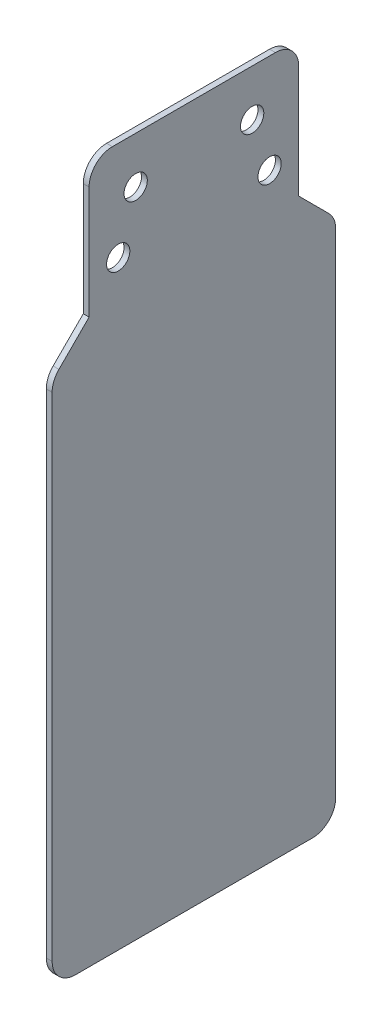
ISO-10303-21;
HEADER;
FILE_DESCRIPTION(('STEP AP214'),'2;1');
FILE_NAME('part.step','',(''),(''),'','','');
FILE_SCHEMA(('AUTOMOTIVE_DESIGN { 1 0 10303 214 1 1 1 1 }'));
ENDSEC;
DATA;
#1=APPLICATION_CONTEXT('core data for automotive mechanical design processes');
#2=APPLICATION_PROTOCOL_DEFINITION('international standard','automotive_design',2000,#1);
#3=PRODUCT_CONTEXT('',#1,'mechanical');
#4=PRODUCT('Part','Part','',(#3));
#5=PRODUCT_RELATED_PRODUCT_CATEGORY('part','',(#4));
#6=PRODUCT_DEFINITION_FORMATION('','',#4);
#7=PRODUCT_DEFINITION_CONTEXT('part definition',#1,'design');
#8=PRODUCT_DEFINITION('design','',#6,#7);
#9=PRODUCT_DEFINITION_SHAPE('','',#8);
#10=(LENGTH_UNIT() NAMED_UNIT(*) SI_UNIT(.MILLI.,.METRE.));
#11=(NAMED_UNIT(*) PLANE_ANGLE_UNIT() SI_UNIT($,.RADIAN.));
#12=(NAMED_UNIT(*) SI_UNIT($,.STERADIAN.) SOLID_ANGLE_UNIT());
#13=UNCERTAINTY_MEASURE_WITH_UNIT(LENGTH_MEASURE(1.E-05),#10,'distance_accuracy_value','');
#14=(GEOMETRIC_REPRESENTATION_CONTEXT(3) GLOBAL_UNCERTAINTY_ASSIGNED_CONTEXT((#13)) GLOBAL_UNIT_ASSIGNED_CONTEXT((#10,
#11,#12)) REPRESENTATION_CONTEXT('',''));
#15=CARTESIAN_POINT('',(0.,0.,0.));
#16=DIRECTION('',(0.,0.,1.));
#17=DIRECTION('',(1.,0.,0.));
#18=AXIS2_PLACEMENT_3D('',#15,#16,#17);
#19=CARTESIAN_POINT('',(1.,0.,-18.));
#20=DIRECTION('',(0.,0.,-1.));
#21=DIRECTION('',(0.,1.,0.));
#22=AXIS2_PLACEMENT_3D('',#19,#20,#21);
#23=PLANE('',#22);
#24=DIRECTION('',(0.,-1.,0.));
#25=VECTOR('',#24,1.);
#26=CARTESIAN_POINT('',(0.,0.,-18.));
#27=LINE('',#26,#25);
#28=CARTESIAN_POINT('',(0.,-3.99999999999999,-18.));
#29=VERTEX_POINT('',#28);
#30=CARTESIAN_POINT('',(0.,-23.35,-18.));
#31=VERTEX_POINT('',#30);
#32=EDGE_CURVE('E163',#29,#31,#27,.T.);
#33=ORIENTED_EDGE('',*,*,#32,.F.);
#34=DIRECTION('',(-1.,0.,0.));
#35=VECTOR('',#34,1.);
#36=CARTESIAN_POINT('',(1.,-3.99999999999999,-18.));
#37=LINE('',#36,#35);
#38=CARTESIAN_POINT('',(1.,-3.99999999999999,-18.));
#39=VERTEX_POINT('',#38);
#40=EDGE_CURVE('E11',#29,#39,#37,.F.);
#41=ORIENTED_EDGE('',*,*,#40,.T.);
#42=DIRECTION('',(0.,-1.,0.));
#43=VECTOR('',#42,1.);
#44=CARTESIAN_POINT('',(1.,0.,-18.));
#45=LINE('',#44,#43);
#46=CARTESIAN_POINT('',(1.,-23.35,-18.));
#47=VERTEX_POINT('',#46);
#48=EDGE_CURVE('E242',#39,#47,#45,.T.);
#49=ORIENTED_EDGE('',*,*,#48,.T.);
#50=DIRECTION('',(-1.,0.,0.));
#51=VECTOR('',#50,1.);
#52=CARTESIAN_POINT('',(97.858375992993,-23.35,-18.));
#53=LINE('',#52,#51);
#54=EDGE_CURVE('E150',#47,#31,#53,.T.);
#55=ORIENTED_EDGE('',*,*,#54,.T.);
#56=EDGE_LOOP('',(#33,#41,#49,#55));
#57=FACE_BOUND('',#56,.T.);
#58=ADVANCED_FACE('F36',(#57),#23,.T.);
#59=CARTESIAN_POINT('',(1.,0.,18.));
#60=DIRECTION('',(0.,0.,-1.));
#61=DIRECTION('',(0.,1.,0.));
#62=AXIS2_PLACEMENT_3D('',#59,#60,#61);
#63=PLANE('',#62);
#64=DIRECTION('',(0.,-1.,0.));
#65=VECTOR('',#64,1.);
#66=CARTESIAN_POINT('',(1.,0.,18.));
#67=LINE('',#66,#65);
#68=CARTESIAN_POINT('',(1.,-4.,18.));
#69=VERTEX_POINT('',#68);
#70=CARTESIAN_POINT('',(1.,-23.35,18.));
#71=VERTEX_POINT('',#70);
#72=EDGE_CURVE('E247',#69,#71,#67,.T.);
#73=ORIENTED_EDGE('',*,*,#72,.F.);
#74=DIRECTION('',(-1.,0.,0.));
#75=VECTOR('',#74,1.);
#76=CARTESIAN_POINT('',(0.,-4.,18.));
#77=LINE('',#76,#75);
#78=CARTESIAN_POINT('',(0.,-4.,18.));
#79=VERTEX_POINT('',#78);
#80=EDGE_CURVE('E249',#69,#79,#77,.T.);
#81=ORIENTED_EDGE('',*,*,#80,.T.);
#82=DIRECTION('',(0.,-1.,0.));
#83=VECTOR('',#82,1.);
#84=CARTESIAN_POINT('',(0.,0.,18.));
#85=LINE('',#84,#83);
#86=CARTESIAN_POINT('',(0.,-23.35,18.));
#87=VERTEX_POINT('',#86);
#88=EDGE_CURVE('E243',#79,#87,#85,.T.);
#89=ORIENTED_EDGE('',*,*,#88,.T.);
#90=DIRECTION('',(-1.,0.,0.));
#91=VECTOR('',#90,1.);
#92=CARTESIAN_POINT('',(97.858375992993,-23.35,18.));
#93=LINE('',#92,#91);
#94=EDGE_CURVE('E187',#71,#87,#93,.T.);
#95=ORIENTED_EDGE('',*,*,#94,.F.);
#96=EDGE_LOOP('',(#73,#81,#89,#95));
#97=FACE_BOUND('',#96,.T.);
#98=ADVANCED_FACE('F275',(#97),#63,.F.);
#99=CARTESIAN_POINT('',(1.,0.,18.));
#100=DIRECTION('',(0.,1.,0.));
#101=DIRECTION('',(0.,0.,1.));
#102=AXIS2_PLACEMENT_3D('',#99,#100,#101);
#103=PLANE('',#102);
#104=DIRECTION('',(0.,0.,-1.));
#105=VECTOR('',#104,1.);
#106=CARTESIAN_POINT('',(0.,0.,18.));
#107=LINE('',#106,#105);
#108=CARTESIAN_POINT('',(0.,0.,14.));
#109=VERTEX_POINT('',#108);
#110=CARTESIAN_POINT('',(0.,0.,-14.));
#111=VERTEX_POINT('',#110);
#112=EDGE_CURVE('E239',#109,#111,#107,.T.);
#113=ORIENTED_EDGE('',*,*,#112,.F.);
#114=DIRECTION('',(-1.,0.,0.));
#115=VECTOR('',#114,1.);
#116=CARTESIAN_POINT('',(1.,0.,14.));
#117=LINE('',#116,#115);
#118=CARTESIAN_POINT('',(1.,0.,14.));
#119=VERTEX_POINT('',#118);
#120=EDGE_CURVE('E265',#109,#119,#117,.F.);
#121=ORIENTED_EDGE('',*,*,#120,.T.);
#122=DIRECTION('',(0.,0.,-1.));
#123=VECTOR('',#122,1.);
#124=CARTESIAN_POINT('',(1.,0.,18.));
#125=LINE('',#124,#123);
#126=CARTESIAN_POINT('',(1.,0.,-14.));
#127=VERTEX_POINT('',#126);
#128=EDGE_CURVE('E240',#119,#127,#125,.T.);
#129=ORIENTED_EDGE('',*,*,#128,.T.);
#130=DIRECTION('',(-1.,0.,0.));
#131=VECTOR('',#130,1.);
#132=CARTESIAN_POINT('',(1.,0.,-14.));
#133=LINE('',#132,#131);
#134=EDGE_CURVE('E262',#127,#111,#133,.T.);
#135=ORIENTED_EDGE('',*,*,#134,.T.);
#136=EDGE_LOOP('',(#113,#121,#129,#135));
#137=FACE_BOUND('',#136,.T.);
#138=ADVANCED_FACE('F280',(#137),#103,.T.);
#139=CARTESIAN_POINT('',(1.,-120.,18.));
#140=DIRECTION('',(0.,1.,0.));
#141=DIRECTION('',(0.,0.,1.));
#142=AXIS2_PLACEMENT_3D('',#139,#140,#141);
#143=PLANE('',#142);
#144=DIRECTION('',(0.,0.,-1.));
#145=VECTOR('',#144,1.);
#146=CARTESIAN_POINT('',(0.,-120.,18.));
#147=LINE('',#146,#145);
#148=CARTESIAN_POINT('',(0.,-120.,20.35));
#149=VERTEX_POINT('',#148);
#150=CARTESIAN_POINT('',(0.,-120.,-20.35));
#151=VERTEX_POINT('',#150);
#152=EDGE_CURVE('E253',#149,#151,#147,.T.);
#153=ORIENTED_EDGE('',*,*,#152,.T.);
#154=DIRECTION('',(-1.,0.,0.));
#155=VECTOR('',#154,1.);
#156=CARTESIAN_POINT('',(97.858375992993,-120.,-20.35));
#157=LINE('',#156,#155);
#158=CARTESIAN_POINT('',(1.,-120.,-20.35));
#159=VERTEX_POINT('',#158);
#160=EDGE_CURVE('E173',#159,#151,#157,.T.);
#161=ORIENTED_EDGE('',*,*,#160,.F.);
#162=DIRECTION('',(0.,0.,-1.));
#163=VECTOR('',#162,1.);
#164=CARTESIAN_POINT('',(1.,-120.,18.));
#165=LINE('',#164,#163);
#166=CARTESIAN_POINT('',(1.,-120.,20.35));
#167=VERTEX_POINT('',#166);
#168=EDGE_CURVE('E245',#167,#159,#165,.T.);
#169=ORIENTED_EDGE('',*,*,#168,.F.);
#170=DIRECTION('',(-1.,0.,0.));
#171=VECTOR('',#170,1.);
#172=CARTESIAN_POINT('',(97.858375992993,-120.,20.35));
#173=LINE('',#172,#171);
#174=EDGE_CURVE('E205',#167,#149,#173,.T.);
#175=ORIENTED_EDGE('',*,*,#174,.T.);
#176=EDGE_LOOP('',(#153,#161,#169,#175));
#177=FACE_BOUND('',#176,.T.);
#178=ADVANCED_FACE('F297',(#177),#143,.F.);
#179=CARTESIAN_POINT('',(1.,0.,0.));
#180=DIRECTION('',(-1.,0.,0.));
#181=DIRECTION('',(0.,0.,1.));
#182=AXIS2_PLACEMENT_3D('',#179,#180,#181);
#183=PLANE('',#182);
#184=CARTESIAN_POINT('',(1.,-17.,-13.));
#185=DIRECTION('',(-1.,0.,0.));
#186=DIRECTION('',(0.,0.,1.));
#187=AXIS2_PLACEMENT_3D('',#184,#185,#186);
#188=CIRCLE('',#187,2.);
#189=CARTESIAN_POINT('',(1.,-17.,-11.));
#190=VERTEX_POINT('',#189);
#191=EDGE_CURVE('E218',#190,#190,#188,.T.);
#192=ORIENTED_EDGE('',*,*,#191,.T.);
#193=EDGE_LOOP('',(#192));
#194=FACE_BOUND('',#193,.T.);
#195=CARTESIAN_POINT('',(1.,-17.,13.));
#196=DIRECTION('',(-1.,0.,0.));
#197=DIRECTION('',(0.,0.,1.));
#198=AXIS2_PLACEMENT_3D('',#195,#196,#197);
#199=CIRCLE('',#198,2.);
#200=CARTESIAN_POINT('',(1.,-17.,15.));
#201=VERTEX_POINT('',#200);
#202=EDGE_CURVE('E224',#201,#201,#199,.T.);
#203=ORIENTED_EDGE('',*,*,#202,.T.);
#204=EDGE_LOOP('',(#203));
#205=FACE_BOUND('',#204,.T.);
#206=CARTESIAN_POINT('',(1.,-8.,-9.99999999999999));
#207=DIRECTION('',(-1.,0.,0.));
#208=DIRECTION('',(0.,0.,1.));
#209=AXIS2_PLACEMENT_3D('',#206,#207,#208);
#210=CIRCLE('',#209,2.);
#211=CARTESIAN_POINT('',(1.,-8.,-7.99999999999999));
#212=VERTEX_POINT('',#211);
#213=EDGE_CURVE('E230',#212,#212,#210,.T.);
#214=ORIENTED_EDGE('',*,*,#213,.T.);
#215=EDGE_LOOP('',(#214));
#216=FACE_BOUND('',#215,.T.);
#217=CARTESIAN_POINT('',(1.,-8.,10.));
#218=DIRECTION('',(-1.,0.,0.));
#219=DIRECTION('',(0.,0.,1.));
#220=AXIS2_PLACEMENT_3D('',#217,#218,#219);
#221=CIRCLE('',#220,2.);
#222=CARTESIAN_POINT('',(1.,-8.,12.));
#223=VERTEX_POINT('',#222);
#224=EDGE_CURVE('E236',#223,#223,#221,.T.);
#225=ORIENTED_EDGE('',*,*,#224,.T.);
#226=EDGE_LOOP('',(#225));
#227=FACE_BOUND('',#226,.T.);
#228=ORIENTED_EDGE('',*,*,#128,.F.);
#229=CARTESIAN_POINT('',(1.,-4.,14.));
#230=DIRECTION('',(-1.,0.,0.));
#231=DIRECTION('',(0.,0.,1.));
#232=AXIS2_PLACEMENT_3D('',#229,#230,#231);
#233=CIRCLE('',#232,4.);
#234=EDGE_CURVE('E44',#119,#69,#233,.F.);
#235=ORIENTED_EDGE('',*,*,#234,.T.);
#236=ORIENTED_EDGE('',*,*,#72,.T.);
#237=DIRECTION('',(0.,-0.707106781186551,0.707106781186544));
#238=VECTOR('',#237,1.);
#239=CARTESIAN_POINT('',(1.,-23.35,18.));
#240=LINE('',#239,#238);
#241=CARTESIAN_POINT('',(1.,-28.5284271247463,23.1784271247462));
#242=VERTEX_POINT('',#241);
#243=EDGE_CURVE('E191',#71,#242,#240,.T.);
#244=ORIENTED_EDGE('',*,*,#243,.T.);
#245=CARTESIAN_POINT('',(1.,-31.3568542494924,20.35));
#246=DIRECTION('',(-1.,0.,0.));
#247=DIRECTION('',(0.,0.,1.));
#248=AXIS2_PLACEMENT_3D('',#245,#246,#247);
#249=CIRCLE('',#248,4.);
#250=CARTESIAN_POINT('',(1.,-31.3568542494924,24.35));
#251=VERTEX_POINT('',#250);
#252=EDGE_CURVE('E189',#242,#251,#249,.F.);
#253=ORIENTED_EDGE('',*,*,#252,.T.);
#254=DIRECTION('',(0.,-1.,0.));
#255=VECTOR('',#254,1.);
#256=CARTESIAN_POINT('',(1.,-31.3568542494924,24.35));
#257=LINE('',#256,#255);
#258=CARTESIAN_POINT('',(1.,-116.,24.35));
#259=VERTEX_POINT('',#258);
#260=EDGE_CURVE('E186',#251,#259,#257,.T.);
#261=ORIENTED_EDGE('',*,*,#260,.T.);
#262=CARTESIAN_POINT('',(1.,-116.,20.35));
#263=DIRECTION('',(-1.,0.,0.));
#264=DIRECTION('',(0.,0.,1.));
#265=AXIS2_PLACEMENT_3D('',#262,#263,#264);
#266=CIRCLE('',#265,4.);
#267=EDGE_CURVE('E183',#259,#167,#266,.F.);
#268=ORIENTED_EDGE('',*,*,#267,.T.);
#269=ORIENTED_EDGE('',*,*,#168,.T.);
#270=CARTESIAN_POINT('',(1.,-116.,-20.35));
#271=DIRECTION('',(-1.,0.,0.));
#272=DIRECTION('',(0.,0.,1.));
#273=AXIS2_PLACEMENT_3D('',#270,#271,#272);
#274=CIRCLE('',#273,4.);
#275=CARTESIAN_POINT('',(1.,-116.,-24.35));
#276=VERTEX_POINT('',#275);
#277=EDGE_CURVE('E166',#159,#276,#274,.F.);
#278=ORIENTED_EDGE('',*,*,#277,.T.);
#279=DIRECTION('',(0.,1.,0.));
#280=VECTOR('',#279,1.);
#281=CARTESIAN_POINT('',(1.,-31.3568542494924,-24.35));
#282=LINE('',#281,#280);
#283=CARTESIAN_POINT('',(1.,-31.3568542494924,-24.35));
#284=VERTEX_POINT('',#283);
#285=EDGE_CURVE('E284',#276,#284,#282,.T.);
#286=ORIENTED_EDGE('',*,*,#285,.T.);
#287=CARTESIAN_POINT('',(1.,-31.3568542494924,-20.35));
#288=DIRECTION('',(-1.,0.,0.));
#289=DIRECTION('',(0.,0.,1.));
#290=AXIS2_PLACEMENT_3D('',#287,#288,#289);
#291=CIRCLE('',#290,4.);
#292=CARTESIAN_POINT('',(1.,-28.5284271247463,-23.1784271247462));
#293=VERTEX_POINT('',#292);
#294=EDGE_CURVE('E176',#284,#293,#291,.F.);
#295=ORIENTED_EDGE('',*,*,#294,.T.);
#296=DIRECTION('',(0.,0.707106781186552,0.707106781186543));
#297=VECTOR('',#296,1.);
#298=CARTESIAN_POINT('',(1.,-23.35,-18.));
#299=LINE('',#298,#297);
#300=EDGE_CURVE('E146',#293,#47,#299,.T.);
#301=ORIENTED_EDGE('',*,*,#300,.T.);
#302=ORIENTED_EDGE('',*,*,#48,.F.);
#303=CARTESIAN_POINT('',(1.,-3.99999999999999,-14.));
#304=DIRECTION('',(-1.,0.,0.));
#305=DIRECTION('',(0.,0.,1.));
#306=AXIS2_PLACEMENT_3D('',#303,#304,#305);
#307=CIRCLE('',#306,4.);
#308=EDGE_CURVE('E56',#39,#127,#307,.F.);
#309=ORIENTED_EDGE('',*,*,#308,.T.);
#310=EDGE_LOOP('',(#228,#235,#236,#244,#253,#261,#268,#269,#278,#286,#295,#301,#302,#309));
#311=FACE_BOUND('',#310,.T.);
#312=ADVANCED_FACE('F269',(#194,#205,#216,#227,#311),#183,.F.);
#313=CARTESIAN_POINT('',(0.,0.,0.));
#314=DIRECTION('',(-1.,0.,0.));
#315=DIRECTION('',(0.,0.,1.));
#316=AXIS2_PLACEMENT_3D('',#313,#314,#315);
#317=PLANE('',#316);
#318=CARTESIAN_POINT('',(0.,-17.,-13.));
#319=DIRECTION('',(-1.,0.,0.));
#320=DIRECTION('',(0.,0.,1.));
#321=AXIS2_PLACEMENT_3D('',#318,#319,#320);
#322=CIRCLE('',#321,2.);
#323=CARTESIAN_POINT('',(0.,-17.,-11.));
#324=VERTEX_POINT('',#323);
#325=EDGE_CURVE('E193',#324,#324,#322,.T.);
#326=ORIENTED_EDGE('',*,*,#325,.F.);
#327=EDGE_LOOP('',(#326));
#328=FACE_BOUND('',#327,.T.);
#329=CARTESIAN_POINT('',(0.,-17.,13.));
#330=DIRECTION('',(-1.,0.,0.));
#331=DIRECTION('',(0.,0.,1.));
#332=AXIS2_PLACEMENT_3D('',#329,#330,#331);
#333=CIRCLE('',#332,2.);
#334=CARTESIAN_POINT('',(0.,-17.,15.));
#335=VERTEX_POINT('',#334);
#336=EDGE_CURVE('E221',#335,#335,#333,.T.);
#337=ORIENTED_EDGE('',*,*,#336,.F.);
#338=EDGE_LOOP('',(#337));
#339=FACE_BOUND('',#338,.T.);
#340=CARTESIAN_POINT('',(0.,-8.,-9.99999999999999));
#341=DIRECTION('',(-1.,0.,0.));
#342=DIRECTION('',(0.,0.,1.));
#343=AXIS2_PLACEMENT_3D('',#340,#341,#342);
#344=CIRCLE('',#343,2.);
#345=CARTESIAN_POINT('',(0.,-8.,-7.99999999999999));
#346=VERTEX_POINT('',#345);
#347=EDGE_CURVE('E227',#346,#346,#344,.T.);
#348=ORIENTED_EDGE('',*,*,#347,.F.);
#349=EDGE_LOOP('',(#348));
#350=FACE_BOUND('',#349,.T.);
#351=CARTESIAN_POINT('',(0.,-8.,10.));
#352=DIRECTION('',(-1.,0.,0.));
#353=DIRECTION('',(0.,0.,1.));
#354=AXIS2_PLACEMENT_3D('',#351,#352,#353);
#355=CIRCLE('',#354,2.);
#356=CARTESIAN_POINT('',(0.,-8.,12.));
#357=VERTEX_POINT('',#356);
#358=EDGE_CURVE('E233',#357,#357,#355,.T.);
#359=ORIENTED_EDGE('',*,*,#358,.F.);
#360=EDGE_LOOP('',(#359));
#361=FACE_BOUND('',#360,.T.);
#362=ORIENTED_EDGE('',*,*,#88,.F.);
#363=CARTESIAN_POINT('',(0.,-4.,14.));
#364=DIRECTION('',(-1.,0.,0.));
#365=DIRECTION('',(0.,0.,1.));
#366=AXIS2_PLACEMENT_3D('',#363,#364,#365);
#367=CIRCLE('',#366,4.);
#368=EDGE_CURVE('E260',#79,#109,#367,.T.);
#369=ORIENTED_EDGE('',*,*,#368,.T.);
#370=ORIENTED_EDGE('',*,*,#112,.T.);
#371=CARTESIAN_POINT('',(0.,-3.99999999999999,-14.));
#372=DIRECTION('',(-1.,0.,0.));
#373=DIRECTION('',(0.,0.,1.));
#374=AXIS2_PLACEMENT_3D('',#371,#372,#373);
#375=CIRCLE('',#374,4.);
#376=EDGE_CURVE('E258',#111,#29,#375,.T.);
#377=ORIENTED_EDGE('',*,*,#376,.T.);
#378=ORIENTED_EDGE('',*,*,#32,.T.);
#379=DIRECTION('',(0.,-0.707106781186552,-0.707106781186543));
#380=VECTOR('',#379,1.);
#381=CARTESIAN_POINT('',(0.,-23.35,-18.));
#382=LINE('',#381,#380);
#383=CARTESIAN_POINT('',(0.,-28.5284271247463,-23.1784271247462));
#384=VERTEX_POINT('',#383);
#385=EDGE_CURVE('E143',#31,#384,#382,.T.);
#386=ORIENTED_EDGE('',*,*,#385,.T.);
#387=CARTESIAN_POINT('',(0.,-31.3568542494924,-20.35));
#388=DIRECTION('',(-1.,0.,0.));
#389=DIRECTION('',(0.,0.,1.));
#390=AXIS2_PLACEMENT_3D('',#387,#388,#389);
#391=CIRCLE('',#390,4.);
#392=CARTESIAN_POINT('',(0.,-31.3568542494924,-24.35));
#393=VERTEX_POINT('',#392);
#394=EDGE_CURVE('E153',#384,#393,#391,.T.);
#395=ORIENTED_EDGE('',*,*,#394,.T.);
#396=DIRECTION('',(0.,-1.,0.));
#397=VECTOR('',#396,1.);
#398=CARTESIAN_POINT('',(0.,-31.3568542494924,-24.35));
#399=LINE('',#398,#397);
#400=CARTESIAN_POINT('',(0.,-116.,-24.35));
#401=VERTEX_POINT('',#400);
#402=EDGE_CURVE('E159',#393,#401,#399,.T.);
#403=ORIENTED_EDGE('',*,*,#402,.T.);
#404=CARTESIAN_POINT('',(0.,-116.,-20.35));
#405=DIRECTION('',(-1.,0.,0.));
#406=DIRECTION('',(0.,0.,1.));
#407=AXIS2_PLACEMENT_3D('',#404,#405,#406);
#408=CIRCLE('',#407,4.);
#409=EDGE_CURVE('E170',#401,#151,#408,.T.);
#410=ORIENTED_EDGE('',*,*,#409,.T.);
#411=ORIENTED_EDGE('',*,*,#152,.F.);
#412=CARTESIAN_POINT('',(0.,-116.,20.35));
#413=DIRECTION('',(-1.,0.,0.));
#414=DIRECTION('',(0.,0.,-1.));
#415=AXIS2_PLACEMENT_3D('',#412,#413,#414);
#416=CIRCLE('',#415,4.);
#417=CARTESIAN_POINT('',(0.,-116.,24.35));
#418=VERTEX_POINT('',#417);
#419=EDGE_CURVE('E182',#149,#418,#416,.T.);
#420=ORIENTED_EDGE('',*,*,#419,.T.);
#421=DIRECTION('',(0.,1.,0.));
#422=VECTOR('',#421,1.);
#423=CARTESIAN_POINT('',(0.,-31.3568542494924,24.35));
#424=LINE('',#423,#422);
#425=CARTESIAN_POINT('',(0.,-31.3568542494924,24.35));
#426=VERTEX_POINT('',#425);
#427=EDGE_CURVE('E196',#418,#426,#424,.T.);
#428=ORIENTED_EDGE('',*,*,#427,.T.);
#429=CARTESIAN_POINT('',(0.,-31.3568542494924,20.35));
#430=DIRECTION('',(-1.,0.,0.));
#431=DIRECTION('',(0.,0.,-1.));
#432=AXIS2_PLACEMENT_3D('',#429,#430,#431);
#433=CIRCLE('',#432,4.);
#434=CARTESIAN_POINT('',(0.,-28.5284271247463,23.1784271247462));
#435=VERTEX_POINT('',#434);
#436=EDGE_CURVE('E199',#426,#435,#433,.T.);
#437=ORIENTED_EDGE('',*,*,#436,.T.);
#438=DIRECTION('',(0.,0.707106781186551,-0.707106781186544));
#439=VECTOR('',#438,1.);
#440=CARTESIAN_POINT('',(0.,-23.35,18.));
#441=LINE('',#440,#439);
#442=EDGE_CURVE('E202',#435,#87,#441,.T.);
#443=ORIENTED_EDGE('',*,*,#442,.T.);
#444=EDGE_LOOP('',(#362,#369,#370,#377,#378,#386,#395,#403,#410,#411,#420,#428,#437,#443));
#445=FACE_BOUND('',#444,.T.);
#446=ADVANCED_FACE('F162',(#328,#339,#350,#361,#445),#317,.T.);
#447=CARTESIAN_POINT('',(0.,-8.,10.));
#448=DIRECTION('',(-1.,0.,0.));
#449=DIRECTION('',(0.,0.,1.));
#450=AXIS2_PLACEMENT_3D('',#447,#448,#449);
#451=CYLINDRICAL_SURFACE('',#450,2.);
#452=ORIENTED_EDGE('',*,*,#224,.F.);
#453=EDGE_LOOP('',(#452));
#454=FACE_BOUND('',#453,.T.);
#455=ORIENTED_EDGE('',*,*,#358,.T.);
#456=EDGE_LOOP('',(#455));
#457=FACE_BOUND('',#456,.T.);
#458=ADVANCED_FACE('F364',(#454,#457),#451,.F.);
#459=CARTESIAN_POINT('',(0.,-8.,-9.99999999999999));
#460=DIRECTION('',(-1.,0.,0.));
#461=DIRECTION('',(0.,0.,1.));
#462=AXIS2_PLACEMENT_3D('',#459,#460,#461);
#463=CYLINDRICAL_SURFACE('',#462,2.);
#464=ORIENTED_EDGE('',*,*,#213,.F.);
#465=EDGE_LOOP('',(#464));
#466=FACE_BOUND('',#465,.T.);
#467=ORIENTED_EDGE('',*,*,#347,.T.);
#468=EDGE_LOOP('',(#467));
#469=FACE_BOUND('',#468,.T.);
#470=ADVANCED_FACE('F360',(#466,#469),#463,.F.);
#471=CARTESIAN_POINT('',(0.,-17.,13.));
#472=DIRECTION('',(-1.,0.,0.));
#473=DIRECTION('',(0.,0.,1.));
#474=AXIS2_PLACEMENT_3D('',#471,#472,#473);
#475=CYLINDRICAL_SURFACE('',#474,2.);
#476=ORIENTED_EDGE('',*,*,#202,.F.);
#477=EDGE_LOOP('',(#476));
#478=FACE_BOUND('',#477,.T.);
#479=ORIENTED_EDGE('',*,*,#336,.T.);
#480=EDGE_LOOP('',(#479));
#481=FACE_BOUND('',#480,.T.);
#482=ADVANCED_FACE('F356',(#478,#481),#475,.F.);
#483=CARTESIAN_POINT('',(0.,-17.,-13.));
#484=DIRECTION('',(-1.,0.,0.));
#485=DIRECTION('',(0.,0.,1.));
#486=AXIS2_PLACEMENT_3D('',#483,#484,#485);
#487=CYLINDRICAL_SURFACE('',#486,2.);
#488=ORIENTED_EDGE('',*,*,#191,.F.);
#489=EDGE_LOOP('',(#488));
#490=FACE_BOUND('',#489,.T.);
#491=ORIENTED_EDGE('',*,*,#325,.T.);
#492=EDGE_LOOP('',(#491));
#493=FACE_BOUND('',#492,.T.);
#494=ADVANCED_FACE('F322',(#490,#493),#487,.F.);
#495=CARTESIAN_POINT('',(97.858375992993,-23.35,18.));
#496=DIRECTION('',(0.,0.707106781186544,0.707106781186551));
#497=DIRECTION('',(0.,-0.707106781186551,0.707106781186544));
#498=AXIS2_PLACEMENT_3D('',#495,#496,#497);
#499=PLANE('',#498);
#500=ORIENTED_EDGE('',*,*,#243,.F.);
#501=ORIENTED_EDGE('',*,*,#94,.T.);
#502=ORIENTED_EDGE('',*,*,#442,.F.);
#503=DIRECTION('',(-1.,0.,0.));
#504=VECTOR('',#503,1.);
#505=CARTESIAN_POINT('',(97.858375992993,-28.5284271247463,23.1784271247462));
#506=LINE('',#505,#504);
#507=EDGE_CURVE('E208',#242,#435,#506,.T.);
#508=ORIENTED_EDGE('',*,*,#507,.F.);
#509=EDGE_LOOP('',(#500,#501,#502,#508));
#510=FACE_BOUND('',#509,.T.);
#511=ADVANCED_FACE('F312',(#510),#499,.T.);
#512=CARTESIAN_POINT('',(97.858375992993,-31.3568542494924,20.35));
#513=DIRECTION('',(-1.,0.,0.));
#514=DIRECTION('',(0.,0.,1.));
#515=AXIS2_PLACEMENT_3D('',#512,#513,#514);
#516=CYLINDRICAL_SURFACE('',#515,4.);
#517=ORIENTED_EDGE('',*,*,#252,.F.);
#518=ORIENTED_EDGE('',*,*,#507,.T.);
#519=ORIENTED_EDGE('',*,*,#436,.F.);
#520=DIRECTION('',(-1.,0.,0.));
#521=VECTOR('',#520,1.);
#522=CARTESIAN_POINT('',(97.858375992993,-31.3568542494924,24.35));
#523=LINE('',#522,#521);
#524=EDGE_CURVE('E210',#251,#426,#523,.T.);
#525=ORIENTED_EDGE('',*,*,#524,.F.);
#526=EDGE_LOOP('',(#517,#518,#519,#525));
#527=FACE_BOUND('',#526,.T.);
#528=ADVANCED_FACE('F314',(#527),#516,.T.);
#529=CARTESIAN_POINT('',(97.858375992993,-31.3568542494924,24.35));
#530=DIRECTION('',(0.,0.,1.));
#531=DIRECTION('',(0.,-1.,0.));
#532=AXIS2_PLACEMENT_3D('',#529,#530,#531);
#533=PLANE('',#532);
#534=ORIENTED_EDGE('',*,*,#260,.F.);
#535=ORIENTED_EDGE('',*,*,#524,.T.);
#536=ORIENTED_EDGE('',*,*,#427,.F.);
#537=DIRECTION('',(-1.,0.,0.));
#538=VECTOR('',#537,1.);
#539=CARTESIAN_POINT('',(97.858375992993,-116.,24.35));
#540=LINE('',#539,#538);
#541=EDGE_CURVE('E212',#259,#418,#540,.T.);
#542=ORIENTED_EDGE('',*,*,#541,.F.);
#543=EDGE_LOOP('',(#534,#535,#536,#542));
#544=FACE_BOUND('',#543,.T.);
#545=ADVANCED_FACE('F305',(#544),#533,.T.);
#546=CARTESIAN_POINT('',(97.858375992993,-116.,20.35));
#547=DIRECTION('',(-1.,0.,0.));
#548=DIRECTION('',(0.,0.,1.));
#549=AXIS2_PLACEMENT_3D('',#546,#547,#548);
#550=CYLINDRICAL_SURFACE('',#549,4.);
#551=ORIENTED_EDGE('',*,*,#267,.F.);
#552=ORIENTED_EDGE('',*,*,#541,.T.);
#553=ORIENTED_EDGE('',*,*,#419,.F.);
#554=ORIENTED_EDGE('',*,*,#174,.F.);
#555=EDGE_LOOP('',(#551,#552,#553,#554));
#556=FACE_BOUND('',#555,.T.);
#557=ADVANCED_FACE('F300',(#556),#550,.T.);
#558=CARTESIAN_POINT('',(97.858375992993,-116.,-20.35));
#559=DIRECTION('',(-1.,0.,0.));
#560=DIRECTION('',(0.,0.,1.));
#561=AXIS2_PLACEMENT_3D('',#558,#559,#560);
#562=CYLINDRICAL_SURFACE('',#561,4.);
#563=ORIENTED_EDGE('',*,*,#277,.F.);
#564=ORIENTED_EDGE('',*,*,#160,.T.);
#565=ORIENTED_EDGE('',*,*,#409,.F.);
#566=DIRECTION('',(-1.,0.,0.));
#567=VECTOR('',#566,1.);
#568=CARTESIAN_POINT('',(97.858375992993,-116.,-24.35));
#569=LINE('',#568,#567);
#570=EDGE_CURVE('E177',#276,#401,#569,.T.);
#571=ORIENTED_EDGE('',*,*,#570,.F.);
#572=EDGE_LOOP('',(#563,#564,#565,#571));
#573=FACE_BOUND('',#572,.T.);
#574=ADVANCED_FACE('F293',(#573),#562,.T.);
#575=CARTESIAN_POINT('',(97.858375992993,-31.3568542494924,-24.35));
#576=DIRECTION('',(0.,0.,-1.));
#577=DIRECTION('',(0.,1.,0.));
#578=AXIS2_PLACEMENT_3D('',#575,#576,#577);
#579=PLANE('',#578);
#580=ORIENTED_EDGE('',*,*,#285,.F.);
#581=ORIENTED_EDGE('',*,*,#570,.T.);
#582=ORIENTED_EDGE('',*,*,#402,.F.);
#583=DIRECTION('',(-1.,0.,0.));
#584=VECTOR('',#583,1.);
#585=CARTESIAN_POINT('',(97.858375992993,-31.3568542494924,-24.35));
#586=LINE('',#585,#584);
#587=EDGE_CURVE('E149',#284,#393,#586,.T.);
#588=ORIENTED_EDGE('',*,*,#587,.F.);
#589=EDGE_LOOP('',(#580,#581,#582,#588));
#590=FACE_BOUND('',#589,.T.);
#591=ADVANCED_FACE('F291',(#590),#579,.T.);
#592=CARTESIAN_POINT('',(97.858375992993,-31.3568542494924,-20.35));
#593=DIRECTION('',(-1.,0.,0.));
#594=DIRECTION('',(0.,0.,1.));
#595=AXIS2_PLACEMENT_3D('',#592,#593,#594);
#596=CYLINDRICAL_SURFACE('',#595,4.);
#597=ORIENTED_EDGE('',*,*,#294,.F.);
#598=ORIENTED_EDGE('',*,*,#587,.T.);
#599=ORIENTED_EDGE('',*,*,#394,.F.);
#600=DIRECTION('',(-1.,0.,0.));
#601=VECTOR('',#600,1.);
#602=CARTESIAN_POINT('',(97.858375992993,-28.5284271247463,-23.1784271247462));
#603=LINE('',#602,#601);
#604=EDGE_CURVE('E138',#293,#384,#603,.T.);
#605=ORIENTED_EDGE('',*,*,#604,.F.);
#606=EDGE_LOOP('',(#597,#598,#599,#605));
#607=FACE_BOUND('',#606,.T.);
#608=ADVANCED_FACE('F154',(#607),#596,.T.);
#609=CARTESIAN_POINT('',(97.858375992993,-23.35,-18.));
#610=DIRECTION('',(0.,0.707106781186543,-0.707106781186552));
#611=DIRECTION('',(0.,0.707106781186552,0.707106781186543));
#612=AXIS2_PLACEMENT_3D('',#609,#610,#611);
#613=PLANE('',#612);
#614=ORIENTED_EDGE('',*,*,#300,.F.);
#615=ORIENTED_EDGE('',*,*,#604,.T.);
#616=ORIENTED_EDGE('',*,*,#385,.F.);
#617=ORIENTED_EDGE('',*,*,#54,.F.);
#618=EDGE_LOOP('',(#614,#615,#616,#617));
#619=FACE_BOUND('',#618,.T.);
#620=ADVANCED_FACE('F140',(#619),#613,.T.);
#621=CARTESIAN_POINT('',(1.,-4.,14.));
#622=DIRECTION('',(1.,0.,0.));
#623=DIRECTION('',(0.,0.,-1.));
#624=AXIS2_PLACEMENT_3D('',#621,#622,#623);
#625=CYLINDRICAL_SURFACE('',#624,4.);
#626=ORIENTED_EDGE('',*,*,#234,.F.);
#627=ORIENTED_EDGE('',*,*,#120,.F.);
#628=ORIENTED_EDGE('',*,*,#368,.F.);
#629=ORIENTED_EDGE('',*,*,#80,.F.);
#630=EDGE_LOOP('',(#626,#627,#628,#629));
#631=FACE_BOUND('',#630,.T.);
#632=ADVANCED_FACE('F277',(#631),#625,.T.);
#633=CARTESIAN_POINT('',(1.,-3.99999999999999,-14.));
#634=DIRECTION('',(-1.,0.,0.));
#635=DIRECTION('',(0.,0.,1.));
#636=AXIS2_PLACEMENT_3D('',#633,#634,#635);
#637=CYLINDRICAL_SURFACE('',#636,4.);
#638=ORIENTED_EDGE('',*,*,#308,.F.);
#639=ORIENTED_EDGE('',*,*,#40,.F.);
#640=ORIENTED_EDGE('',*,*,#376,.F.);
#641=ORIENTED_EDGE('',*,*,#134,.F.);
#642=EDGE_LOOP('',(#638,#639,#640,#641));
#643=FACE_BOUND('',#642,.T.);
#644=ADVANCED_FACE('F38',(#643),#637,.T.);
#645=CLOSED_SHELL('',(#58,#98,#138,#178,#312,#446,#458,#470,#482,#494,#511,#528,#545,#557,#574,
#591,#608,#620,#632,#644));
#646=MANIFOLD_SOLID_BREP('B2',#645);
#647=ADVANCED_BREP_SHAPE_REPRESENTATION('',(#18,#646),#14);
#648=SHAPE_DEFINITION_REPRESENTATION(#9,#647);
ENDSEC;
END-ISO-10303-21;
